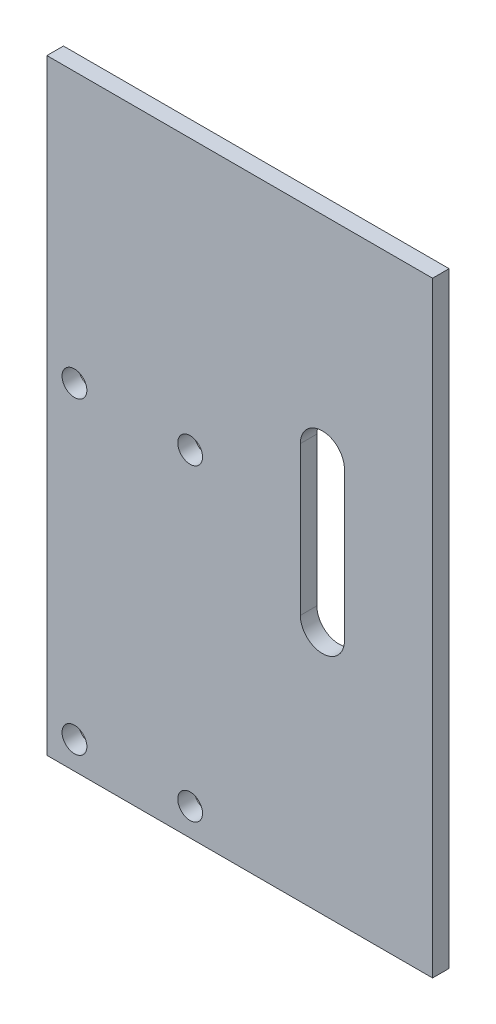
ISO-10303-21;
HEADER;
FILE_DESCRIPTION(('STEP AP214'),'2;1');
FILE_NAME('part.step','',(''),(''),'','','');
FILE_SCHEMA(('AUTOMOTIVE_DESIGN { 1 0 10303 214 1 1 1 1 }'));
ENDSEC;
DATA;
#1=APPLICATION_CONTEXT('core data for automotive mechanical design processes');
#2=APPLICATION_PROTOCOL_DEFINITION('international standard','automotive_design',2000,#1);
#3=PRODUCT_CONTEXT('',#1,'mechanical');
#4=PRODUCT('Part','Part','',(#3));
#5=PRODUCT_RELATED_PRODUCT_CATEGORY('part','',(#4));
#6=PRODUCT_DEFINITION_FORMATION('','',#4);
#7=PRODUCT_DEFINITION_CONTEXT('part definition',#1,'design');
#8=PRODUCT_DEFINITION('design','',#6,#7);
#9=PRODUCT_DEFINITION_SHAPE('','',#8);
#10=(LENGTH_UNIT() NAMED_UNIT(*) SI_UNIT(.MILLI.,.METRE.));
#11=(NAMED_UNIT(*) PLANE_ANGLE_UNIT() SI_UNIT($,.RADIAN.));
#12=(NAMED_UNIT(*) SI_UNIT($,.STERADIAN.) SOLID_ANGLE_UNIT());
#13=UNCERTAINTY_MEASURE_WITH_UNIT(LENGTH_MEASURE(1.E-05),#10,'distance_accuracy_value','');
#14=(GEOMETRIC_REPRESENTATION_CONTEXT(3) GLOBAL_UNCERTAINTY_ASSIGNED_CONTEXT((#13)) GLOBAL_UNIT_ASSIGNED_CONTEXT((#10,
#11,#12)) REPRESENTATION_CONTEXT('',''));
#15=CARTESIAN_POINT('',(0.,0.,0.));
#16=DIRECTION('',(0.,0.,1.));
#17=DIRECTION('',(1.,0.,0.));
#18=AXIS2_PLACEMENT_3D('',#15,#16,#17);
#19=CARTESIAN_POINT('',(-9.00000000000001,6.00000000000001,3.));
#20=DIRECTION('',(0.,0.,1.));
#21=DIRECTION('',(1.,0.,0.));
#22=AXIS2_PLACEMENT_3D('',#19,#20,#21);
#23=CYLINDRICAL_SURFACE('',#22,2.25);
#24=CARTESIAN_POINT('',(-9.00000000000001,6.00000000000001,0.));
#25=DIRECTION('',(0.,0.,1.));
#26=DIRECTION('',(1.,0.,0.));
#27=AXIS2_PLACEMENT_3D('',#24,#25,#26);
#28=CIRCLE('',#27,2.25);
#29=CARTESIAN_POINT('',(-6.75000000000002,6.00000000000001,0.));
#30=VERTEX_POINT('',#29);
#31=EDGE_CURVE('E127',#30,#30,#28,.T.);
#32=ORIENTED_EDGE('',*,*,#31,.F.);
#33=EDGE_LOOP('',(#32));
#34=FACE_BOUND('',#33,.T.);
#35=CARTESIAN_POINT('',(-9.00000000000001,6.00000000000001,3.));
#36=DIRECTION('',(0.,0.,1.));
#37=DIRECTION('',(1.,0.,0.));
#38=AXIS2_PLACEMENT_3D('',#35,#36,#37);
#39=CIRCLE('',#38,2.25);
#40=CARTESIAN_POINT('',(-6.75000000000002,6.00000000000001,3.));
#41=VERTEX_POINT('',#40);
#42=EDGE_CURVE('E13',#41,#41,#39,.T.);
#43=ORIENTED_EDGE('',*,*,#42,.T.);
#44=EDGE_LOOP('',(#43));
#45=FACE_BOUND('',#44,.T.);
#46=ADVANCED_FACE('F119',(#34,#45),#23,.F.);
#47=CARTESIAN_POINT('',(-9.00000000000001,-50.,3.));
#48=DIRECTION('',(0.,0.,1.));
#49=DIRECTION('',(1.,0.,0.));
#50=AXIS2_PLACEMENT_3D('',#47,#48,#49);
#51=CYLINDRICAL_SURFACE('',#50,2.25);
#52=CARTESIAN_POINT('',(-9.00000000000001,-50.,0.));
#53=DIRECTION('',(0.,0.,1.));
#54=DIRECTION('',(1.,0.,0.));
#55=AXIS2_PLACEMENT_3D('',#52,#53,#54);
#56=CIRCLE('',#55,2.25);
#57=CARTESIAN_POINT('',(-6.75000000000002,-50.,0.));
#58=VERTEX_POINT('',#57);
#59=EDGE_CURVE('E284',#58,#58,#56,.T.);
#60=ORIENTED_EDGE('',*,*,#59,.F.);
#61=EDGE_LOOP('',(#60));
#62=FACE_BOUND('',#61,.T.);
#63=CARTESIAN_POINT('',(-9.00000000000001,-50.,3.));
#64=DIRECTION('',(0.,0.,1.));
#65=DIRECTION('',(1.,0.,0.));
#66=AXIS2_PLACEMENT_3D('',#63,#64,#65);
#67=CIRCLE('',#66,2.25);
#68=CARTESIAN_POINT('',(-6.75000000000002,-50.,3.));
#69=VERTEX_POINT('',#68);
#70=EDGE_CURVE('E288',#69,#69,#67,.T.);
#71=ORIENTED_EDGE('',*,*,#70,.T.);
#72=EDGE_LOOP('',(#71));
#73=FACE_BOUND('',#72,.T.);
#74=ADVANCED_FACE('F300',(#62,#73),#51,.F.);
#75=CARTESIAN_POINT('',(35.,55.,3.));
#76=DIRECTION('',(-1.,0.,0.));
#77=DIRECTION('',(0.,-1.,0.));
#78=AXIS2_PLACEMENT_3D('',#75,#76,#77);
#79=PLANE('',#78);
#80=DIRECTION('',(0.,1.,0.));
#81=VECTOR('',#80,1.);
#82=CARTESIAN_POINT('',(35.,55.,0.));
#83=LINE('',#82,#81);
#84=CARTESIAN_POINT('',(35.,-55.,0.));
#85=VERTEX_POINT('',#84);
#86=CARTESIAN_POINT('',(35.,55.,0.));
#87=VERTEX_POINT('',#86);
#88=EDGE_CURVE('E242',#85,#87,#83,.T.);
#89=ORIENTED_EDGE('',*,*,#88,.T.);
#90=DIRECTION('',(0.,0.,-1.));
#91=VECTOR('',#90,1.);
#92=CARTESIAN_POINT('',(35.,55.,3.));
#93=LINE('',#92,#91);
#94=CARTESIAN_POINT('',(35.,55.,3.));
#95=VERTEX_POINT('',#94);
#96=EDGE_CURVE('E280',#95,#87,#93,.T.);
#97=ORIENTED_EDGE('',*,*,#96,.F.);
#98=DIRECTION('',(0.,1.,0.));
#99=VECTOR('',#98,1.);
#100=CARTESIAN_POINT('',(35.,55.,3.));
#101=LINE('',#100,#99);
#102=CARTESIAN_POINT('',(35.,-55.,3.));
#103=VERTEX_POINT('',#102);
#104=EDGE_CURVE('E243',#103,#95,#101,.T.);
#105=ORIENTED_EDGE('',*,*,#104,.F.);
#106=DIRECTION('',(0.,0.,-1.));
#107=VECTOR('',#106,1.);
#108=CARTESIAN_POINT('',(35.,-55.,3.));
#109=LINE('',#108,#107);
#110=EDGE_CURVE('E257',#103,#85,#109,.T.);
#111=ORIENTED_EDGE('',*,*,#110,.T.);
#112=EDGE_LOOP('',(#89,#97,#105,#111));
#113=FACE_BOUND('',#112,.T.);
#114=ADVANCED_FACE('F328',(#113),#79,.F.);
#115=CARTESIAN_POINT('',(-35.,55.,3.));
#116=DIRECTION('',(0.,-1.,0.));
#117=DIRECTION('',(0.,0.,-1.));
#118=AXIS2_PLACEMENT_3D('',#115,#116,#117);
#119=PLANE('',#118);
#120=DIRECTION('',(-1.,0.,0.));
#121=VECTOR('',#120,1.);
#122=CARTESIAN_POINT('',(-35.,55.,0.));
#123=LINE('',#122,#121);
#124=CARTESIAN_POINT('',(-35.,55.,0.));
#125=VERTEX_POINT('',#124);
#126=EDGE_CURVE('E261',#87,#125,#123,.T.);
#127=ORIENTED_EDGE('',*,*,#126,.T.);
#128=DIRECTION('',(0.,0.,-1.));
#129=VECTOR('',#128,1.);
#130=CARTESIAN_POINT('',(-35.,55.,3.));
#131=LINE('',#130,#129);
#132=CARTESIAN_POINT('',(-35.,55.,3.));
#133=VERTEX_POINT('',#132);
#134=EDGE_CURVE('E276',#133,#125,#131,.T.);
#135=ORIENTED_EDGE('',*,*,#134,.F.);
#136=DIRECTION('',(-1.,0.,0.));
#137=VECTOR('',#136,1.);
#138=CARTESIAN_POINT('',(-35.,55.,3.));
#139=LINE('',#138,#137);
#140=EDGE_CURVE('E247',#95,#133,#139,.T.);
#141=ORIENTED_EDGE('',*,*,#140,.F.);
#142=ORIENTED_EDGE('',*,*,#96,.T.);
#143=EDGE_LOOP('',(#127,#135,#141,#142));
#144=FACE_BOUND('',#143,.T.);
#145=ADVANCED_FACE('F324',(#144),#119,.F.);
#146=CARTESIAN_POINT('',(-35.,55.,3.));
#147=DIRECTION('',(1.,0.,0.));
#148=DIRECTION('',(0.,1.,0.));
#149=AXIS2_PLACEMENT_3D('',#146,#147,#148);
#150=PLANE('',#149);
#151=DIRECTION('',(0.,-1.,0.));
#152=VECTOR('',#151,1.);
#153=CARTESIAN_POINT('',(-35.,55.,0.));
#154=LINE('',#153,#152);
#155=CARTESIAN_POINT('',(-35.,-55.,0.));
#156=VERTEX_POINT('',#155);
#157=EDGE_CURVE('E264',#125,#156,#154,.T.);
#158=ORIENTED_EDGE('',*,*,#157,.T.);
#159=DIRECTION('',(0.,0.,-1.));
#160=VECTOR('',#159,1.);
#161=CARTESIAN_POINT('',(-35.,-55.,3.));
#162=LINE('',#161,#160);
#163=CARTESIAN_POINT('',(-35.,-55.,3.));
#164=VERTEX_POINT('',#163);
#165=EDGE_CURVE('E272',#164,#156,#162,.T.);
#166=ORIENTED_EDGE('',*,*,#165,.F.);
#167=DIRECTION('',(0.,-1.,0.));
#168=VECTOR('',#167,1.);
#169=CARTESIAN_POINT('',(-35.,55.,3.));
#170=LINE('',#169,#168);
#171=EDGE_CURVE('E251',#133,#164,#170,.T.);
#172=ORIENTED_EDGE('',*,*,#171,.F.);
#173=ORIENTED_EDGE('',*,*,#134,.T.);
#174=EDGE_LOOP('',(#158,#166,#172,#173));
#175=FACE_BOUND('',#174,.T.);
#176=ADVANCED_FACE('F314',(#175),#150,.F.);
#177=CARTESIAN_POINT('',(-35.,-55.,3.));
#178=DIRECTION('',(0.,1.,0.));
#179=DIRECTION('',(0.,0.,1.));
#180=AXIS2_PLACEMENT_3D('',#177,#178,#179);
#181=PLANE('',#180);
#182=DIRECTION('',(1.,0.,0.));
#183=VECTOR('',#182,1.);
#184=CARTESIAN_POINT('',(-35.,-55.,0.));
#185=LINE('',#184,#183);
#186=EDGE_CURVE('E248',#156,#85,#185,.T.);
#187=ORIENTED_EDGE('',*,*,#186,.T.);
#188=ORIENTED_EDGE('',*,*,#110,.F.);
#189=DIRECTION('',(1.,0.,0.));
#190=VECTOR('',#189,1.);
#191=CARTESIAN_POINT('',(-35.,-55.,3.));
#192=LINE('',#191,#190);
#193=EDGE_CURVE('E254',#164,#103,#192,.T.);
#194=ORIENTED_EDGE('',*,*,#193,.F.);
#195=ORIENTED_EDGE('',*,*,#165,.T.);
#196=EDGE_LOOP('',(#187,#188,#194,#195));
#197=FACE_BOUND('',#196,.T.);
#198=ADVANCED_FACE('F305',(#197),#181,.F.);
#199=CARTESIAN_POINT('',(0.,0.,3.));
#200=DIRECTION('',(0.,0.,1.));
#201=DIRECTION('',(1.,0.,0.));
#202=AXIS2_PLACEMENT_3D('',#199,#200,#201);
#203=PLANE('',#202);
#204=DIRECTION('',(0.,1.,0.));
#205=VECTOR('',#204,1.);
#206=CARTESIAN_POINT('',(11.,-10.,3.));
#207=LINE('',#206,#205);
#208=CARTESIAN_POINT('',(11.,-10.,3.));
#209=VERTEX_POINT('',#208);
#210=CARTESIAN_POINT('',(11.,17.,3.));
#211=VERTEX_POINT('',#210);
#212=EDGE_CURVE('E200',#209,#211,#207,.T.);
#213=ORIENTED_EDGE('',*,*,#212,.T.);
#214=CARTESIAN_POINT('',(15.,17.,3.));
#215=DIRECTION('',(0.,0.,1.));
#216=DIRECTION('',(1.,0.,0.));
#217=AXIS2_PLACEMENT_3D('',#214,#215,#216);
#218=CIRCLE('',#217,3.99999999999999);
#219=CARTESIAN_POINT('',(19.,17.,3.));
#220=VERTEX_POINT('',#219);
#221=EDGE_CURVE('E216',#220,#211,#218,.T.);
#222=ORIENTED_EDGE('',*,*,#221,.F.);
#223=DIRECTION('',(0.,1.,0.));
#224=VECTOR('',#223,1.);
#225=CARTESIAN_POINT('',(19.,-10.,3.));
#226=LINE('',#225,#224);
#227=CARTESIAN_POINT('',(19.,-10.,3.));
#228=VERTEX_POINT('',#227);
#229=EDGE_CURVE('E188',#228,#220,#226,.T.);
#230=ORIENTED_EDGE('',*,*,#229,.F.);
#231=CARTESIAN_POINT('',(15.,-10.,3.));
#232=DIRECTION('',(0.,0.,1.));
#233=DIRECTION('',(1.,0.,0.));
#234=AXIS2_PLACEMENT_3D('',#231,#232,#233);
#235=CIRCLE('',#234,3.99999999999999);
#236=EDGE_CURVE('E197',#209,#228,#235,.T.);
#237=ORIENTED_EDGE('',*,*,#236,.F.);
#238=EDGE_LOOP('',(#213,#222,#230,#237));
#239=FACE_BOUND('',#238,.T.);
#240=CARTESIAN_POINT('',(-30.,6.00000000000001,3.));
#241=DIRECTION('',(0.,0.,1.));
#242=DIRECTION('',(1.,0.,0.));
#243=AXIS2_PLACEMENT_3D('',#240,#241,#242);
#244=CIRCLE('',#243,2.25);
#245=CARTESIAN_POINT('',(-27.75,6.00000000000001,3.));
#246=VERTEX_POINT('',#245);
#247=EDGE_CURVE('E230',#246,#246,#244,.T.);
#248=ORIENTED_EDGE('',*,*,#247,.F.);
#249=EDGE_LOOP('',(#248));
#250=FACE_BOUND('',#249,.T.);
#251=CARTESIAN_POINT('',(-30.,-50.,3.));
#252=DIRECTION('',(0.,0.,1.));
#253=DIRECTION('',(1.,0.,0.));
#254=AXIS2_PLACEMENT_3D('',#251,#252,#253);
#255=CIRCLE('',#254,2.25);
#256=CARTESIAN_POINT('',(-27.75,-50.,3.));
#257=VERTEX_POINT('',#256);
#258=EDGE_CURVE('E234',#257,#257,#255,.T.);
#259=ORIENTED_EDGE('',*,*,#258,.F.);
#260=EDGE_LOOP('',(#259));
#261=FACE_BOUND('',#260,.T.);
#262=ORIENTED_EDGE('',*,*,#104,.T.);
#263=ORIENTED_EDGE('',*,*,#140,.T.);
#264=ORIENTED_EDGE('',*,*,#171,.T.);
#265=ORIENTED_EDGE('',*,*,#193,.T.);
#266=EDGE_LOOP('',(#262,#263,#264,#265));
#267=FACE_BOUND('',#266,.T.);
#268=ORIENTED_EDGE('',*,*,#70,.F.);
#269=EDGE_LOOP('',(#268));
#270=FACE_BOUND('',#269,.T.);
#271=ORIENTED_EDGE('',*,*,#42,.F.);
#272=EDGE_LOOP('',(#271));
#273=FACE_BOUND('',#272,.T.);
#274=ADVANCED_FACE('F303',(#239,#250,#261,#267,#270,#273),#203,.T.);
#275=CARTESIAN_POINT('',(0.,0.,0.));
#276=DIRECTION('',(0.,0.,1.));
#277=DIRECTION('',(1.,0.,0.));
#278=AXIS2_PLACEMENT_3D('',#275,#276,#277);
#279=PLANE('',#278);
#280=DIRECTION('',(0.,1.,0.));
#281=VECTOR('',#280,1.);
#282=CARTESIAN_POINT('',(19.,-10.,0.));
#283=LINE('',#282,#281);
#284=CARTESIAN_POINT('',(19.,-10.,0.));
#285=VERTEX_POINT('',#284);
#286=CARTESIAN_POINT('',(19.,17.,0.));
#287=VERTEX_POINT('',#286);
#288=EDGE_CURVE('E181',#285,#287,#283,.T.);
#289=ORIENTED_EDGE('',*,*,#288,.T.);
#290=CARTESIAN_POINT('',(15.,17.,0.));
#291=DIRECTION('',(0.,0.,1.));
#292=DIRECTION('',(1.,0.,0.));
#293=AXIS2_PLACEMENT_3D('',#290,#291,#292);
#294=CIRCLE('',#293,3.99999999999999);
#295=CARTESIAN_POINT('',(11.,17.,0.));
#296=VERTEX_POINT('',#295);
#297=EDGE_CURVE('E220',#287,#296,#294,.T.);
#298=ORIENTED_EDGE('',*,*,#297,.T.);
#299=DIRECTION('',(0.,1.,0.));
#300=VECTOR('',#299,1.);
#301=CARTESIAN_POINT('',(11.,-10.,0.));
#302=LINE('',#301,#300);
#303=CARTESIAN_POINT('',(11.,-10.,0.));
#304=VERTEX_POINT('',#303);
#305=EDGE_CURVE('E187',#304,#296,#302,.T.);
#306=ORIENTED_EDGE('',*,*,#305,.F.);
#307=CARTESIAN_POINT('',(15.,-10.,0.));
#308=DIRECTION('',(0.,0.,1.));
#309=DIRECTION('',(1.,0.,0.));
#310=AXIS2_PLACEMENT_3D('',#307,#308,#309);
#311=CIRCLE('',#310,3.99999999999999);
#312=EDGE_CURVE('E194',#304,#285,#311,.T.);
#313=ORIENTED_EDGE('',*,*,#312,.T.);
#314=EDGE_LOOP('',(#289,#298,#306,#313));
#315=FACE_BOUND('',#314,.T.);
#316=CARTESIAN_POINT('',(-30.,6.00000000000001,0.));
#317=DIRECTION('',(0.,0.,1.));
#318=DIRECTION('',(1.,0.,0.));
#319=AXIS2_PLACEMENT_3D('',#316,#317,#318);
#320=CIRCLE('',#319,2.25);
#321=CARTESIAN_POINT('',(-27.75,6.00000000000001,0.));
#322=VERTEX_POINT('',#321);
#323=EDGE_CURVE('E226',#322,#322,#320,.T.);
#324=ORIENTED_EDGE('',*,*,#323,.T.);
#325=EDGE_LOOP('',(#324));
#326=FACE_BOUND('',#325,.T.);
#327=CARTESIAN_POINT('',(-30.,-50.,0.));
#328=DIRECTION('',(0.,0.,1.));
#329=DIRECTION('',(1.,0.,0.));
#330=AXIS2_PLACEMENT_3D('',#327,#328,#329);
#331=CIRCLE('',#330,2.25);
#332=CARTESIAN_POINT('',(-27.75,-50.,0.));
#333=VERTEX_POINT('',#332);
#334=EDGE_CURVE('E238',#333,#333,#331,.T.);
#335=ORIENTED_EDGE('',*,*,#334,.T.);
#336=EDGE_LOOP('',(#335));
#337=FACE_BOUND('',#336,.T.);
#338=ORIENTED_EDGE('',*,*,#88,.F.);
#339=ORIENTED_EDGE('',*,*,#186,.F.);
#340=ORIENTED_EDGE('',*,*,#157,.F.);
#341=ORIENTED_EDGE('',*,*,#126,.F.);
#342=EDGE_LOOP('',(#338,#339,#340,#341));
#343=FACE_BOUND('',#342,.T.);
#344=ORIENTED_EDGE('',*,*,#59,.T.);
#345=EDGE_LOOP('',(#344));
#346=FACE_BOUND('',#345,.T.);
#347=ORIENTED_EDGE('',*,*,#31,.T.);
#348=EDGE_LOOP('',(#347));
#349=FACE_BOUND('',#348,.T.);
#350=ADVANCED_FACE('F202',(#315,#326,#337,#343,#346,#349),#279,.F.);
#351=CARTESIAN_POINT('',(-30.,-50.,3.));
#352=DIRECTION('',(0.,0.,1.));
#353=DIRECTION('',(1.,0.,0.));
#354=AXIS2_PLACEMENT_3D('',#351,#352,#353);
#355=CYLINDRICAL_SURFACE('',#354,2.25);
#356=ORIENTED_EDGE('',*,*,#334,.F.);
#357=EDGE_LOOP('',(#356));
#358=FACE_BOUND('',#357,.T.);
#359=ORIENTED_EDGE('',*,*,#258,.T.);
#360=EDGE_LOOP('',(#359));
#361=FACE_BOUND('',#360,.T.);
#362=ADVANCED_FACE('F312',(#358,#361),#355,.F.);
#363=CARTESIAN_POINT('',(-30.,6.00000000000001,3.));
#364=DIRECTION('',(0.,0.,1.));
#365=DIRECTION('',(1.,0.,0.));
#366=AXIS2_PLACEMENT_3D('',#363,#364,#365);
#367=CYLINDRICAL_SURFACE('',#366,2.25);
#368=ORIENTED_EDGE('',*,*,#323,.F.);
#369=EDGE_LOOP('',(#368));
#370=FACE_BOUND('',#369,.T.);
#371=ORIENTED_EDGE('',*,*,#247,.T.);
#372=EDGE_LOOP('',(#371));
#373=FACE_BOUND('',#372,.T.);
#374=ADVANCED_FACE('F370',(#370,#373),#367,.F.);
#375=CARTESIAN_POINT('',(15.,17.,3.));
#376=DIRECTION('',(0.,0.,1.));
#377=DIRECTION('',(1.,0.,0.));
#378=AXIS2_PLACEMENT_3D('',#375,#376,#377);
#379=CYLINDRICAL_SURFACE('',#378,3.99999999999999);
#380=ORIENTED_EDGE('',*,*,#297,.F.);
#381=DIRECTION('',(0.,0.,-1.));
#382=VECTOR('',#381,1.);
#383=CARTESIAN_POINT('',(19.,17.,0.));
#384=LINE('',#383,#382);
#385=EDGE_CURVE('E139',#220,#287,#384,.T.);
#386=ORIENTED_EDGE('',*,*,#385,.F.);
#387=ORIENTED_EDGE('',*,*,#221,.T.);
#388=DIRECTION('',(0.,0.,1.));
#389=VECTOR('',#388,1.);
#390=CARTESIAN_POINT('',(11.,17.,3.));
#391=LINE('',#390,#389);
#392=EDGE_CURVE('E223',#296,#211,#391,.T.);
#393=ORIENTED_EDGE('',*,*,#392,.F.);
#394=EDGE_LOOP('',(#380,#386,#387,#393));
#395=FACE_BOUND('',#394,.T.);
#396=ADVANCED_FACE('F394',(#395),#379,.F.);
#397=CARTESIAN_POINT('',(15.,-10.,3.));
#398=DIRECTION('',(0.,0.,1.));
#399=DIRECTION('',(1.,0.,0.));
#400=AXIS2_PLACEMENT_3D('',#397,#398,#399);
#401=CYLINDRICAL_SURFACE('',#400,3.99999999999999);
#402=ORIENTED_EDGE('',*,*,#236,.T.);
#403=DIRECTION('',(0.,0.,-1.));
#404=VECTOR('',#403,1.);
#405=CARTESIAN_POINT('',(19.,-10.,0.));
#406=LINE('',#405,#404);
#407=EDGE_CURVE('E134',#228,#285,#406,.T.);
#408=ORIENTED_EDGE('',*,*,#407,.T.);
#409=ORIENTED_EDGE('',*,*,#312,.F.);
#410=DIRECTION('',(0.,0.,1.));
#411=VECTOR('',#410,1.);
#412=CARTESIAN_POINT('',(11.,-10.,3.));
#413=LINE('',#412,#411);
#414=EDGE_CURVE('E205',#209,#304,#413,.F.);
#415=ORIENTED_EDGE('',*,*,#414,.F.);
#416=EDGE_LOOP('',(#402,#408,#409,#415));
#417=FACE_BOUND('',#416,.T.);
#418=ADVANCED_FACE('F192',(#417),#401,.F.);
#419=CARTESIAN_POINT('',(11.,-10.,3.));
#420=DIRECTION('',(-1.,0.,0.));
#421=DIRECTION('',(0.,0.,1.));
#422=AXIS2_PLACEMENT_3D('',#419,#420,#421);
#423=PLANE('',#422);
#424=ORIENTED_EDGE('',*,*,#392,.T.);
#425=ORIENTED_EDGE('',*,*,#212,.F.);
#426=ORIENTED_EDGE('',*,*,#414,.T.);
#427=ORIENTED_EDGE('',*,*,#305,.T.);
#428=EDGE_LOOP('',(#424,#425,#426,#427));
#429=FACE_BOUND('',#428,.T.);
#430=ADVANCED_FACE('F414',(#429),#423,.F.);
#431=CARTESIAN_POINT('',(19.,-10.,0.));
#432=DIRECTION('',(1.,0.,0.));
#433=DIRECTION('',(0.,0.,-1.));
#434=AXIS2_PLACEMENT_3D('',#431,#432,#433);
#435=PLANE('',#434);
#436=ORIENTED_EDGE('',*,*,#385,.T.);
#437=ORIENTED_EDGE('',*,*,#288,.F.);
#438=ORIENTED_EDGE('',*,*,#407,.F.);
#439=ORIENTED_EDGE('',*,*,#229,.T.);
#440=EDGE_LOOP('',(#436,#437,#438,#439));
#441=FACE_BOUND('',#440,.T.);
#442=ADVANCED_FACE('F182',(#441),#435,.F.);
#443=CLOSED_SHELL('',(#46,#74,#114,#145,#176,#198,#274,#350,#362,#374,#396,#418,#430,#442));
#444=MANIFOLD_SOLID_BREP('B2',#443);
#445=ADVANCED_BREP_SHAPE_REPRESENTATION('',(#18,#444),#14);
#446=SHAPE_DEFINITION_REPRESENTATION(#9,#445);
ENDSEC;
END-ISO-10303-21;
